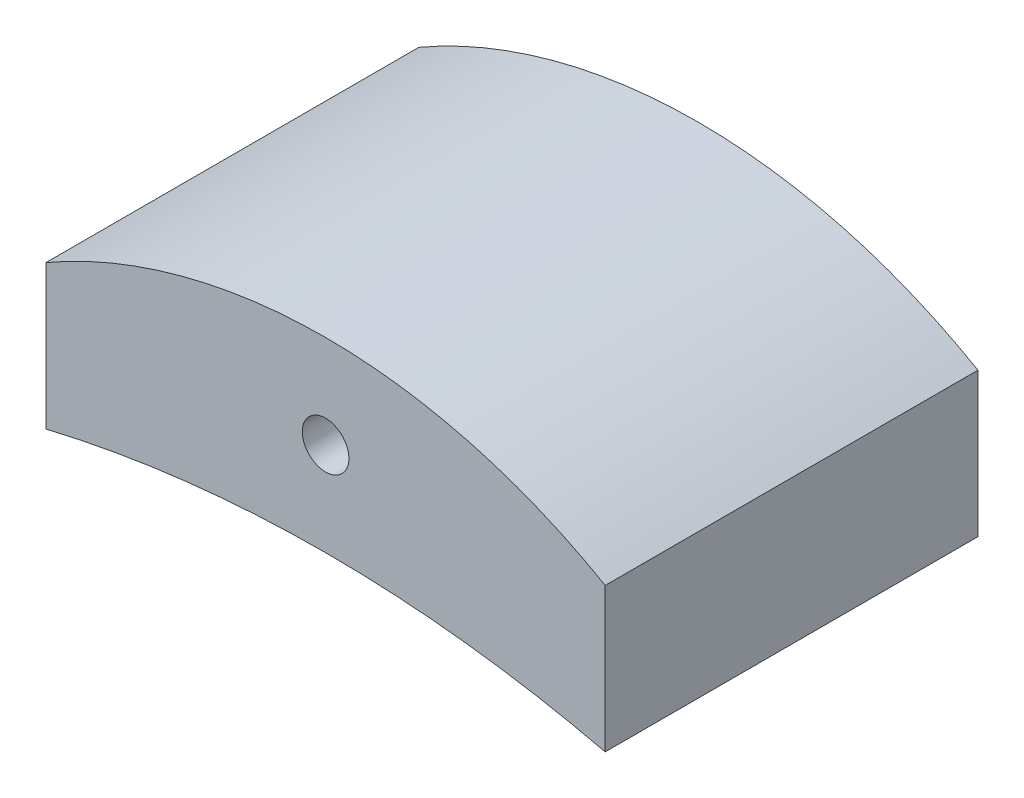
ISO-10303-21;
HEADER;
FILE_DESCRIPTION(('STEP AP214'),'2;1');
FILE_NAME('part.step','',(''),(''),'','','');
FILE_SCHEMA(('AUTOMOTIVE_DESIGN { 1 0 10303 214 1 1 1 1 }'));
ENDSEC;
DATA;
#1=APPLICATION_CONTEXT('core data for automotive mechanical design processes');
#2=APPLICATION_PROTOCOL_DEFINITION('international standard','automotive_design',2000,#1);
#3=PRODUCT_CONTEXT('',#1,'mechanical');
#4=PRODUCT('Part','Part','',(#3));
#5=PRODUCT_RELATED_PRODUCT_CATEGORY('part','',(#4));
#6=PRODUCT_DEFINITION_FORMATION('','',#4);
#7=PRODUCT_DEFINITION_CONTEXT('part definition',#1,'design');
#8=PRODUCT_DEFINITION('design','',#6,#7);
#9=PRODUCT_DEFINITION_SHAPE('','',#8);
#10=(LENGTH_UNIT() NAMED_UNIT(*) SI_UNIT(.MILLI.,.METRE.));
#11=(NAMED_UNIT(*) PLANE_ANGLE_UNIT() SI_UNIT($,.RADIAN.));
#12=(NAMED_UNIT(*) SI_UNIT($,.STERADIAN.) SOLID_ANGLE_UNIT());
#13=UNCERTAINTY_MEASURE_WITH_UNIT(LENGTH_MEASURE(1.E-05),#10,'distance_accuracy_value','');
#14=(GEOMETRIC_REPRESENTATION_CONTEXT(3) GLOBAL_UNCERTAINTY_ASSIGNED_CONTEXT((#13)) GLOBAL_UNIT_ASSIGNED_CONTEXT((#10,
#11,#12)) REPRESENTATION_CONTEXT('',''));
#15=CARTESIAN_POINT('',(0.,0.,0.));
#16=DIRECTION('',(0.,0.,1.));
#17=DIRECTION('',(1.,0.,0.));
#18=AXIS2_PLACEMENT_3D('',#15,#16,#17);
#19=CARTESIAN_POINT('',(38.1,63.5,50.8));
#20=DIRECTION('',(0.,0.,-1.));
#21=DIRECTION('',(-1.,0.,0.));
#22=AXIS2_PLACEMENT_3D('',#19,#20,#21);
#23=CYLINDRICAL_SURFACE('',#22,3.175);
#24=CARTESIAN_POINT('',(38.1,63.5,50.8));
#25=DIRECTION('',(0.,0.,1.));
#26=DIRECTION('',(1.,0.,0.));
#27=AXIS2_PLACEMENT_3D('',#24,#25,#26);
#28=CIRCLE('',#27,3.175);
#29=CARTESIAN_POINT('',(41.275,63.5,50.8));
#30=VERTEX_POINT('',#29);
#31=EDGE_CURVE('E103',#30,#30,#28,.T.);
#32=ORIENTED_EDGE('',*,*,#31,.T.);
#33=EDGE_LOOP('',(#32));
#34=FACE_BOUND('',#33,.T.);
#35=CARTESIAN_POINT('',(38.1,63.5,38.1));
#36=DIRECTION('',(0.,0.,-1.));
#37=DIRECTION('',(-1.,0.,0.));
#38=AXIS2_PLACEMENT_3D('',#35,#36,#37);
#39=CIRCLE('',#38,3.175);
#40=CARTESIAN_POINT('',(34.925,63.5,38.1));
#41=VERTEX_POINT('',#40);
#42=EDGE_CURVE('E38',#41,#41,#39,.T.);
#43=ORIENTED_EDGE('',*,*,#42,.T.);
#44=EDGE_LOOP('',(#43));
#45=FACE_BOUND('',#44,.T.);
#46=ADVANCED_FACE('F35',(#34,#45),#23,.F.);
#47=CARTESIAN_POINT('',(38.1,-114.3,50.8));
#48=DIRECTION('',(0.,0.,-1.));
#49=DIRECTION('',(-1.,0.,0.));
#50=AXIS2_PLACEMENT_3D('',#47,#48,#49);
#51=CYLINDRICAL_SURFACE('',#50,165.1);
#52=CARTESIAN_POINT('',(38.1,-114.3,0.));
#53=DIRECTION('',(0.,0.,1.));
#54=DIRECTION('',(1.,0.,0.));
#55=AXIS2_PLACEMENT_3D('',#52,#53,#54);
#56=CIRCLE('',#55,165.1);
#57=CARTESIAN_POINT('',(76.2,46.3437051365539,0.));
#58=VERTEX_POINT('',#57);
#59=CARTESIAN_POINT('',(0.,46.3437051365539,0.));
#60=VERTEX_POINT('',#59);
#61=EDGE_CURVE('E107',#58,#60,#56,.T.);
#62=ORIENTED_EDGE('',*,*,#61,.F.);
#63=DIRECTION('',(0.,0.,-1.));
#64=VECTOR('',#63,1.);
#65=CARTESIAN_POINT('',(76.2,46.3437051365539,50.8));
#66=LINE('',#65,#64);
#67=CARTESIAN_POINT('',(76.2,46.3437051365539,50.8));
#68=VERTEX_POINT('',#67);
#69=EDGE_CURVE('E11',#68,#58,#66,.T.);
#70=ORIENTED_EDGE('',*,*,#69,.F.);
#71=CARTESIAN_POINT('',(38.1,-114.3,50.8));
#72=DIRECTION('',(0.,0.,1.));
#73=DIRECTION('',(1.,0.,0.));
#74=AXIS2_PLACEMENT_3D('',#71,#72,#73);
#75=CIRCLE('',#74,165.1);
#76=CARTESIAN_POINT('',(0.,46.3437051365539,50.8));
#77=VERTEX_POINT('',#76);
#78=EDGE_CURVE('E90',#68,#77,#75,.T.);
#79=ORIENTED_EDGE('',*,*,#78,.T.);
#80=DIRECTION('',(0.,0.,-1.));
#81=VECTOR('',#80,1.);
#82=CARTESIAN_POINT('',(0.,46.3437051365539,50.8));
#83=LINE('',#82,#81);
#84=EDGE_CURVE('E52',#77,#60,#83,.T.);
#85=ORIENTED_EDGE('',*,*,#84,.T.);
#86=EDGE_LOOP('',(#62,#70,#79,#85));
#87=FACE_BOUND('',#86,.T.);
#88=ADVANCED_FACE('F135',(#87),#51,.F.);
#89=CARTESIAN_POINT('',(76.2,0.,50.8));
#90=DIRECTION('',(-1.,0.,0.));
#91=DIRECTION('',(0.,0.,1.));
#92=AXIS2_PLACEMENT_3D('',#89,#90,#91);
#93=PLANE('',#92);
#94=DIRECTION('',(0.,1.,0.));
#95=VECTOR('',#94,1.);
#96=CARTESIAN_POINT('',(76.2,0.,0.));
#97=LINE('',#96,#95);
#98=CARTESIAN_POINT('',(76.2,65.9911357683743,0.));
#99=VERTEX_POINT('',#98);
#100=EDGE_CURVE('E95',#58,#99,#97,.T.);
#101=ORIENTED_EDGE('',*,*,#100,.T.);
#102=DIRECTION('',(0.,0.,-1.));
#103=VECTOR('',#102,1.);
#104=CARTESIAN_POINT('',(76.2,65.9911357683743,50.8));
#105=LINE('',#104,#103);
#106=CARTESIAN_POINT('',(76.2,65.9911357683743,50.8));
#107=VERTEX_POINT('',#106);
#108=EDGE_CURVE('E44',#107,#99,#105,.T.);
#109=ORIENTED_EDGE('',*,*,#108,.F.);
#110=DIRECTION('',(0.,1.,0.));
#111=VECTOR('',#110,1.);
#112=CARTESIAN_POINT('',(76.2,0.,50.8));
#113=LINE('',#112,#111);
#114=EDGE_CURVE('E86',#68,#107,#113,.T.);
#115=ORIENTED_EDGE('',*,*,#114,.F.);
#116=ORIENTED_EDGE('',*,*,#69,.T.);
#117=EDGE_LOOP('',(#101,#109,#115,#116));
#118=FACE_BOUND('',#117,.T.);
#119=ADVANCED_FACE('F93',(#118),#93,.F.);
#120=CARTESIAN_POINT('',(38.1,0.,50.8));
#121=DIRECTION('',(0.,0.,-1.));
#122=DIRECTION('',(-1.,0.,0.));
#123=AXIS2_PLACEMENT_3D('',#120,#121,#122);
#124=CYLINDRICAL_SURFACE('',#123,76.2);
#125=CARTESIAN_POINT('',(38.1,0.,0.));
#126=DIRECTION('',(0.,0.,1.));
#127=DIRECTION('',(1.,0.,0.));
#128=AXIS2_PLACEMENT_3D('',#125,#126,#127);
#129=CIRCLE('',#128,76.2);
#130=CARTESIAN_POINT('',(0.,65.9911357683743,0.));
#131=VERTEX_POINT('',#130);
#132=EDGE_CURVE('E104',#99,#131,#129,.T.);
#133=ORIENTED_EDGE('',*,*,#132,.T.);
#134=DIRECTION('',(0.,0.,-1.));
#135=VECTOR('',#134,1.);
#136=CARTESIAN_POINT('',(0.,65.9911357683743,50.8));
#137=LINE('',#136,#135);
#138=CARTESIAN_POINT('',(0.,65.9911357683743,50.8));
#139=VERTEX_POINT('',#138);
#140=EDGE_CURVE('E66',#139,#131,#137,.T.);
#141=ORIENTED_EDGE('',*,*,#140,.F.);
#142=CARTESIAN_POINT('',(38.1,0.,50.8));
#143=DIRECTION('',(0.,0.,1.));
#144=DIRECTION('',(1.,0.,0.));
#145=AXIS2_PLACEMENT_3D('',#142,#143,#144);
#146=CIRCLE('',#145,76.2);
#147=EDGE_CURVE('E78',#107,#139,#146,.T.);
#148=ORIENTED_EDGE('',*,*,#147,.F.);
#149=ORIENTED_EDGE('',*,*,#108,.T.);
#150=EDGE_LOOP('',(#133,#141,#148,#149));
#151=FACE_BOUND('',#150,.T.);
#152=ADVANCED_FACE('F80',(#151),#124,.T.);
#153=CARTESIAN_POINT('',(0.,0.,50.8));
#154=DIRECTION('',(-1.,0.,0.));
#155=DIRECTION('',(0.,0.,1.));
#156=AXIS2_PLACEMENT_3D('',#153,#154,#155);
#157=PLANE('',#156);
#158=DIRECTION('',(0.,1.,0.));
#159=VECTOR('',#158,1.);
#160=CARTESIAN_POINT('',(0.,0.,0.));
#161=LINE('',#160,#159);
#162=EDGE_CURVE('E100',#60,#131,#161,.T.);
#163=ORIENTED_EDGE('',*,*,#162,.F.);
#164=ORIENTED_EDGE('',*,*,#84,.F.);
#165=DIRECTION('',(0.,1.,0.));
#166=VECTOR('',#165,1.);
#167=CARTESIAN_POINT('',(0.,0.,50.8));
#168=LINE('',#167,#166);
#169=EDGE_CURVE('E85',#77,#139,#168,.T.);
#170=ORIENTED_EDGE('',*,*,#169,.T.);
#171=ORIENTED_EDGE('',*,*,#140,.T.);
#172=EDGE_LOOP('',(#163,#164,#170,#171));
#173=FACE_BOUND('',#172,.T.);
#174=ADVANCED_FACE('F143',(#173),#157,.T.);
#175=CARTESIAN_POINT('',(0.,0.,50.8));
#176=DIRECTION('',(0.,0.,1.));
#177=DIRECTION('',(1.,0.,0.));
#178=AXIS2_PLACEMENT_3D('',#175,#176,#177);
#179=PLANE('',#178);
#180=ORIENTED_EDGE('',*,*,#31,.F.);
#181=EDGE_LOOP('',(#180));
#182=FACE_BOUND('',#181,.T.);
#183=ORIENTED_EDGE('',*,*,#78,.F.);
#184=ORIENTED_EDGE('',*,*,#114,.T.);
#185=ORIENTED_EDGE('',*,*,#147,.T.);
#186=ORIENTED_EDGE('',*,*,#169,.F.);
#187=EDGE_LOOP('',(#183,#184,#185,#186));
#188=FACE_BOUND('',#187,.T.);
#189=ADVANCED_FACE('F89',(#182,#188),#179,.T.);
#190=CARTESIAN_POINT('',(0.,0.,0.));
#191=DIRECTION('',(0.,0.,1.));
#192=DIRECTION('',(1.,0.,0.));
#193=AXIS2_PLACEMENT_3D('',#190,#191,#192);
#194=PLANE('',#193);
#195=CARTESIAN_POINT('',(38.1,63.5,0.));
#196=DIRECTION('',(0.,0.,-1.));
#197=DIRECTION('',(-1.,0.,0.));
#198=AXIS2_PLACEMENT_3D('',#195,#196,#197);
#199=CIRCLE('',#198,4.7625);
#200=CARTESIAN_POINT('',(33.3375,63.5,0.));
#201=VERTEX_POINT('',#200);
#202=EDGE_CURVE('E113',#201,#201,#199,.T.);
#203=ORIENTED_EDGE('',*,*,#202,.F.);
#204=EDGE_LOOP('',(#203));
#205=FACE_BOUND('',#204,.T.);
#206=ORIENTED_EDGE('',*,*,#61,.T.);
#207=ORIENTED_EDGE('',*,*,#162,.T.);
#208=ORIENTED_EDGE('',*,*,#132,.F.);
#209=ORIENTED_EDGE('',*,*,#100,.F.);
#210=EDGE_LOOP('',(#206,#207,#208,#209));
#211=FACE_BOUND('',#210,.T.);
#212=ADVANCED_FACE('F131',(#205,#211),#194,.F.);
#213=CARTESIAN_POINT('',(38.1,63.5,38.1));
#214=DIRECTION('',(0.,0.,-1.));
#215=DIRECTION('',(-1.,0.,0.));
#216=AXIS2_PLACEMENT_3D('',#213,#214,#215);
#217=CYLINDRICAL_SURFACE('',#216,4.7625);
#218=CARTESIAN_POINT('',(38.1,63.5,38.1));
#219=DIRECTION('',(0.,0.,-1.));
#220=DIRECTION('',(-1.,0.,0.));
#221=AXIS2_PLACEMENT_3D('',#218,#219,#220);
#222=CIRCLE('',#221,4.7625);
#223=CARTESIAN_POINT('',(33.3375,63.5,38.1));
#224=VERTEX_POINT('',#223);
#225=EDGE_CURVE('E116',#224,#224,#222,.T.);
#226=CARTESIAN_POINT('',(33.3375,63.5,38.1));
#227=CARTESIAN_POINT('',(33.3375,63.5,37.703125));
#228=CARTESIAN_POINT('',(33.3375,63.5,37.30625));
#229=CARTESIAN_POINT('',(33.3375,63.5,36.5125));
#230=CARTESIAN_POINT('',(33.3375,63.5,36.115625));
#231=CARTESIAN_POINT('',(33.3375,63.5,35.321875));
#232=CARTESIAN_POINT('',(33.3375,63.5,34.925));
#233=CARTESIAN_POINT('',(33.3375,63.5,34.13125));
#234=CARTESIAN_POINT('',(33.3375,63.5,33.734375));
#235=CARTESIAN_POINT('',(33.3375,63.5,32.940625));
#236=CARTESIAN_POINT('',(33.3375,63.5,32.54375));
#237=CARTESIAN_POINT('',(33.3375,63.5,31.75));
#238=CARTESIAN_POINT('',(33.3375,63.5,31.353125));
#239=CARTESIAN_POINT('',(33.3375,63.5,30.559375));
#240=CARTESIAN_POINT('',(33.3375,63.5,30.1625));
#241=CARTESIAN_POINT('',(33.3375,63.5,29.36875));
#242=CARTESIAN_POINT('',(33.3375,63.5,28.971875));
#243=CARTESIAN_POINT('',(33.3375,63.5,28.178125));
#244=CARTESIAN_POINT('',(33.3375,63.5,27.78125));
#245=CARTESIAN_POINT('',(33.3375,63.5,26.9875));
#246=CARTESIAN_POINT('',(33.3375,63.5,26.590625));
#247=CARTESIAN_POINT('',(33.3375,63.5,25.796875));
#248=CARTESIAN_POINT('',(33.3375,63.5,25.4));
#249=CARTESIAN_POINT('',(33.3375,63.5,24.60625));
#250=CARTESIAN_POINT('',(33.3375,63.5,24.209375));
#251=CARTESIAN_POINT('',(33.3375,63.5,23.415625));
#252=CARTESIAN_POINT('',(33.3375,63.5,23.01875));
#253=CARTESIAN_POINT('',(33.3375,63.5,22.225));
#254=CARTESIAN_POINT('',(33.3375,63.5,21.828125));
#255=CARTESIAN_POINT('',(33.3375,63.5,21.034375));
#256=CARTESIAN_POINT('',(33.3375,63.5,20.6375));
#257=CARTESIAN_POINT('',(33.3375,63.5,19.84375));
#258=CARTESIAN_POINT('',(33.3375,63.5,19.446875));
#259=CARTESIAN_POINT('',(33.3375,63.5,18.653125));
#260=CARTESIAN_POINT('',(33.3375,63.5,18.25625));
#261=CARTESIAN_POINT('',(33.3375,63.5,17.4625));
#262=CARTESIAN_POINT('',(33.3375,63.5,17.065625));
#263=CARTESIAN_POINT('',(33.3375,63.5,16.271875));
#264=CARTESIAN_POINT('',(33.3375,63.5,15.875));
#265=CARTESIAN_POINT('',(33.3375,63.5,15.08125));
#266=CARTESIAN_POINT('',(33.3375,63.5,14.684375));
#267=CARTESIAN_POINT('',(33.3375,63.5,13.890625));
#268=CARTESIAN_POINT('',(33.3375,63.5,13.49375));
#269=CARTESIAN_POINT('',(33.3375,63.5,12.7));
#270=CARTESIAN_POINT('',(33.3375,63.5,12.303125));
#271=CARTESIAN_POINT('',(33.3375,63.5,11.509375));
#272=CARTESIAN_POINT('',(33.3375,63.5,11.1125));
#273=CARTESIAN_POINT('',(33.3375,63.5,10.31875));
#274=CARTESIAN_POINT('',(33.3375,63.5,9.921875));
#275=CARTESIAN_POINT('',(33.3375,63.5,9.128125));
#276=CARTESIAN_POINT('',(33.3375,63.5,8.73125));
#277=CARTESIAN_POINT('',(33.3375,63.5,7.9375));
#278=CARTESIAN_POINT('',(33.3375,63.5,7.540625));
#279=CARTESIAN_POINT('',(33.3375,63.5,6.746875));
#280=CARTESIAN_POINT('',(33.3375,63.5,6.35));
#281=CARTESIAN_POINT('',(33.3375,63.5,5.55625));
#282=CARTESIAN_POINT('',(33.3375,63.5,5.159375));
#283=CARTESIAN_POINT('',(33.3375,63.5,4.365625));
#284=CARTESIAN_POINT('',(33.3375,63.5,3.96875));
#285=CARTESIAN_POINT('',(33.3375,63.5,3.175));
#286=CARTESIAN_POINT('',(33.3375,63.5,2.778125));
#287=CARTESIAN_POINT('',(33.3375,63.5,1.984375));
#288=CARTESIAN_POINT('',(33.3375,63.5,1.5875));
#289=CARTESIAN_POINT('',(33.3375,63.5,0.79375));
#290=CARTESIAN_POINT('',(33.3375,63.5,0.396875));
#291=CARTESIAN_POINT('',(33.3375,63.5,0.));
#292=B_SPLINE_CURVE_WITH_KNOTS('',3,(#226,#227,#228,#229,#230,#231,#232,#233,#234,#235,#236,
#237,#238,#239,#240,#241,#242,#243,#244,#245,#246,#247,#248,#249,#250,#251,#252,#253,#254,#255,
#256,#257,#258,#259,#260,#261,#262,#263,#264,#265,#266,#267,#268,#269,#270,#271,#272,#273,#274,
#275,#276,#277,#278,#279,#280,#281,#282,#283,#284,#285,#286,#287,#288,#289,#290,#291),
.UNSPECIFIED.,.F.,.F.,(4,2,2,2,2,2,2,2,2,2,2,2,2,2,2,2,2,2,2,2,2,2,2,2,2,2,2,2,2,2,2,2,4),(0.,
1.19062499999999,2.38124999999999,3.571875,4.7625,5.953125,7.14375,8.334375,9.525,10.715625,
11.90625,13.096875,14.2875,15.478125,16.66875,17.859375,19.05,20.240625,21.43125,22.621875,
23.8125,25.003125,26.19375,27.384375,28.575,29.765625,30.95625,32.146875,33.3375,34.528125,
35.71875,36.909375,38.1),.UNSPECIFIED.);
#293=EDGE_CURVE('BSEAM126',#224,#201,#292,.T.);
#294=ORIENTED_EDGE('',*,*,#225,.F.);
#295=ORIENTED_EDGE('',*,*,#202,.T.);
#296=ORIENTED_EDGE('',*,*,#293,.T.);
#297=ORIENTED_EDGE('',*,*,#293,.F.);
#298=EDGE_LOOP('',(#294,#296,#295,#297));
#299=FACE_BOUND('',#298,.T.);
#300=ADVANCED_FACE('F126',(#299),#217,.F.);
#301=CARTESIAN_POINT('',(38.1,63.5,38.1));
#302=DIRECTION('',(0.,0.,-1.));
#303=DIRECTION('',(-1.,0.,0.));
#304=AXIS2_PLACEMENT_3D('',#301,#302,#303);
#305=PLANE('',#304);
#306=ORIENTED_EDGE('',*,*,#42,.F.);
#307=EDGE_LOOP('',(#306));
#308=FACE_BOUND('',#307,.T.);
#309=ORIENTED_EDGE('',*,*,#225,.T.);
#310=EDGE_LOOP('',(#309));
#311=FACE_BOUND('',#310,.T.);
#312=ADVANCED_FACE('F124',(#308,#311),#305,.T.);
#313=CLOSED_SHELL('',(#46,#88,#119,#152,#174,#189,#212,#300,#312));
#314=MANIFOLD_SOLID_BREP('B2',#313);
#315=ADVANCED_BREP_SHAPE_REPRESENTATION('',(#18,#314),#14);
#316=SHAPE_DEFINITION_REPRESENTATION(#9,#315);
ENDSEC;
END-ISO-10303-21;
